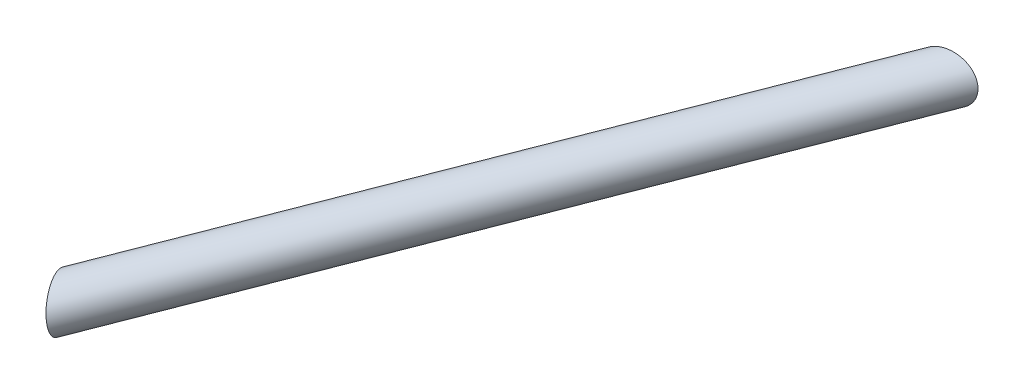
ISO-10303-21;
HEADER;
FILE_DESCRIPTION(('STEP AP214'),'2;1');
FILE_NAME('part.step','',(''),(''),'','','');
FILE_SCHEMA(('AUTOMOTIVE_DESIGN { 1 0 10303 214 1 1 1 1 }'));
ENDSEC;
DATA;
#1=APPLICATION_CONTEXT('core data for automotive mechanical design processes');
#2=APPLICATION_PROTOCOL_DEFINITION('international standard','automotive_design',2000,#1);
#3=PRODUCT_CONTEXT('',#1,'mechanical');
#4=PRODUCT('Part','Part','',(#3));
#5=PRODUCT_RELATED_PRODUCT_CATEGORY('part','',(#4));
#6=PRODUCT_DEFINITION_FORMATION('','',#4);
#7=PRODUCT_DEFINITION_CONTEXT('part definition',#1,'design');
#8=PRODUCT_DEFINITION('design','',#6,#7);
#9=PRODUCT_DEFINITION_SHAPE('','',#8);
#10=(LENGTH_UNIT() NAMED_UNIT(*) SI_UNIT(.MILLI.,.METRE.));
#11=(NAMED_UNIT(*) PLANE_ANGLE_UNIT() SI_UNIT($,.RADIAN.));
#12=(NAMED_UNIT(*) SI_UNIT($,.STERADIAN.) SOLID_ANGLE_UNIT());
#13=UNCERTAINTY_MEASURE_WITH_UNIT(LENGTH_MEASURE(1.E-05),#10,'distance_accuracy_value','');
#14=(GEOMETRIC_REPRESENTATION_CONTEXT(3) GLOBAL_UNCERTAINTY_ASSIGNED_CONTEXT((#13)) GLOBAL_UNIT_ASSIGNED_CONTEXT((#10,
#11,#12)) REPRESENTATION_CONTEXT('',''));
#15=CARTESIAN_POINT('',(0.,0.,0.));
#16=DIRECTION('',(0.,0.,1.));
#17=DIRECTION('',(1.,0.,0.));
#18=AXIS2_PLACEMENT_3D('',#15,#16,#17);
#19=CARTESIAN_POINT('',(50.0000000000001,130.,0.));
#20=DIRECTION('',(0.636784790371593,0.254713916148637,-0.727754046138963));
#21=DIRECTION('',(-0.752576694706878,0.,-0.658504607868518));
#22=AXIS2_PLACEMENT_3D('',#19,#20,#21);
#23=CYLINDRICAL_SURFACE('',#22,7.9);
#24=CARTESIAN_POINT('',(200.,190.,-171.428571428571));
#25=DIRECTION('',(0.,1.,0.));
#26=DIRECTION('',(0.658504607868518,0.,-0.752576694706878));
#27=AXIS2_PLACEMENT_3D('',#24,#25,#26);
#28=ELLIPSE('',#27,31.0151880174069,7.9);
#29=CARTESIAN_POINT('',(210.501750606368,190.,-191.792183638289));
#30=VERTEX_POINT('',#29);
#31=CARTESIAN_POINT('',(208.021674420814,190.,-190.));
#32=VERTEX_POINT('',#31);
#33=EDGE_CURVE('E105',#30,#32,#28,.T.);
#34=ORIENTED_EDGE('',*,*,#33,.T.);
#35=CARTESIAN_POINT('',(216.25,196.5,-190.));
#36=DIRECTION('',(0.,0.,-1.));
#37=DIRECTION('',(0.928476690885259,0.371390676354104,0.));
#38=AXIS2_PLACEMENT_3D('',#35,#36,#37);
#39=ELLIPSE('',#38,10.8553158060924,7.9);
#40=CARTESIAN_POINT('',(225.631031113065,201.793088485731,-190.));
#41=VERTEX_POINT('',#40);
#42=EDGE_CURVE('E94',#32,#41,#39,.T.);
#43=ORIENTED_EDGE('',*,*,#42,.T.);
#44=CARTESIAN_POINT('',(216.296701231053,196.518680492421,-190.053372835489));
#45=DIRECTION('',(0.00725504842418489,-0.00272064315906933,-0.999969980736004));
#46=DIRECTION('',(0.92636602089052,0.376581393205428,0.00569645775229216));
#47=AXIS2_PLACEMENT_3D('',#44,#45,#46);
#48=ELLIPSE('',#47,10.7973779076221,7.9);
#49=CARTESIAN_POINT('',(221.285617721625,190.205319441892,-190.));
#50=VERTEX_POINT('',#49);
#51=EDGE_CURVE('E104',#41,#50,#48,.T.);
#52=ORIENTED_EDGE('',*,*,#51,.T.);
#53=CARTESIAN_POINT('',(220.93155497785,190.,-190.));
#54=VERTEX_POINT('',#53);
#55=EDGE_CURVE('E107',#50,#54,#39,.T.);
#56=ORIENTED_EDGE('',*,*,#55,.T.);
#57=CARTESIAN_POINT('',(220.932059222931,190.,-190.002006543329));
#58=VERTEX_POINT('',#57);
#59=EDGE_CURVE('E57',#54,#58,#28,.T.);
#60=ORIENTED_EDGE('',*,*,#59,.T.);
#61=CARTESIAN_POINT('',(210.067474820191,188.879764778789,-190.077784143776));
#62=VERTEX_POINT('',#61);
#63=EDGE_CURVE('E119',#58,#62,#48,.T.);
#64=ORIENTED_EDGE('',*,*,#63,.T.);
#65=CARTESIAN_POINT('',(212.293529390494,194.917411756198,-185.478319303422));
#66=DIRECTION('',(0.936301069656276,-0.351112901121103,0.00774839511359747));
#67=DIRECTION('',(0.193627409873278,0.497681819611522,-0.845471012261172));
#68=AXIS2_PLACEMENT_3D('',#65,#66,#67);
#69=ELLIPSE('',#68,15.7637429996587,7.9);
#70=EDGE_CURVE('E116',#62,#30,#69,.T.);
#71=ORIENTED_EDGE('',*,*,#70,.T.);
#72=EDGE_LOOP('',(#34,#43,#52,#56,#60,#64,#71));
#73=FACE_BOUND('',#72,.T.);
#74=CARTESIAN_POINT('',(50.,130.,0.));
#75=DIRECTION('',(-0.904650427063292,-0.140780299510552,0.402229427173004));
#76=DIRECTION('',(-0.426154437750217,0.298851652810821,-0.853861865173774));
#77=AXIS2_PLACEMENT_3D('',#74,#75,#76);
#78=ELLIPSE('',#77,8.73265491693323,7.9);
#79=CARTESIAN_POINT('',(46.2785403538077,132.609768355352,-7.45648101529144));
#80=VERTEX_POINT('',#79);
#81=EDGE_CURVE('E43',#80,#80,#78,.T.);
#82=ORIENTED_EDGE('',*,*,#81,.T.);
#83=EDGE_LOOP('',(#82));
#84=FACE_BOUND('',#83,.T.);
#85=ADVANCED_FACE('F39',(#73,#84),#23,.F.);
#86=CARTESIAN_POINT('',(50.0000000000001,130.,0.));
#87=DIRECTION('',(0.636784790371593,0.254713916148637,-0.727754046138963));
#88=DIRECTION('',(-0.752576694706878,0.,-0.658504607868518));
#89=AXIS2_PLACEMENT_3D('',#86,#87,#88);
#90=CYLINDRICAL_SURFACE('',#89,9.5);
#91=CARTESIAN_POINT('',(212.293529390494,194.917411756198,-185.478319303422));
#92=DIRECTION('',(0.936301069656276,-0.351112901121103,0.00774839511359747));
#93=DIRECTION('',(0.193627409873278,0.497681819611522,-0.845471012261172));
#94=AXIS2_PLACEMENT_3D('',#91,#92,#93);
#95=ELLIPSE('',#94,18.9563998097161,9.5);
#96=CARTESIAN_POINT('',(209.403366029717,187.108808004192,-190.077784143776));
#97=VERTEX_POINT('',#96);
#98=CARTESIAN_POINT('',(210.523511327107,190.,-194.42170701778));
#99=VERTEX_POINT('',#98);
#100=EDGE_CURVE('E129',#97,#99,#95,.T.);
#101=ORIENTED_EDGE('',*,*,#100,.F.);
#102=CARTESIAN_POINT('',(216.296701231053,196.518680492421,-190.053372835489));
#103=DIRECTION('',(0.00725504842418489,-0.00272064315906933,-0.999969980736004));
#104=DIRECTION('',(0.92636602089052,0.376581393205428,0.00569645775229216));
#105=AXIS2_PLACEMENT_3D('',#102,#103,#104);
#106=ELLIPSE('',#105,12.9841886230899,9.5);
#107=CARTESIAN_POINT('',(226.472431202689,204.036822058062,-190.));
#108=VERTEX_POINT('',#107);
#109=EDGE_CURVE('E128',#108,#97,#106,.T.);
#110=ORIENTED_EDGE('',*,*,#109,.F.);
#111=CARTESIAN_POINT('',(216.25,196.5,-190.));
#112=DIRECTION('',(0.,0.,-1.));
#113=DIRECTION('',(0.928476690885259,0.371390676354104,0.));
#114=AXIS2_PLACEMENT_3D('',#111,#112,#113);
#115=ELLIPSE('',#114,13.0538607794782,9.5);
#116=CARTESIAN_POINT('',(205.069430309634,190.,-190.));
#117=VERTEX_POINT('',#116);
#118=EDGE_CURVE('E125',#117,#108,#115,.T.);
#119=ORIENTED_EDGE('',*,*,#118,.F.);
#120=CARTESIAN_POINT('',(200.,190.,-171.428571428571));
#121=DIRECTION('',(0.,1.,0.));
#122=DIRECTION('',(0.658504607868518,0.,-0.752576694706878));
#123=AXIS2_PLACEMENT_3D('',#120,#121,#122);
#124=ELLIPSE('',#123,37.2967450842235,9.5);
#125=EDGE_CURVE('E110',#99,#117,#124,.T.);
#126=ORIENTED_EDGE('',*,*,#125,.F.);
#127=EDGE_LOOP('',(#101,#110,#119,#126));
#128=FACE_BOUND('',#127,.T.);
#129=CARTESIAN_POINT('',(50.,130.,0.));
#130=DIRECTION('',(-0.904650427063292,-0.140780299510552,0.402229427173004));
#131=DIRECTION('',(-0.426154437750217,0.298851652810821,-0.853861865173774));
#132=AXIS2_PLACEMENT_3D('',#129,#130,#131);
#133=ELLIPSE('',#132,10.5012938874513,9.5);
#134=CARTESIAN_POINT('',(45.5248270077434,133.138329034917,-8.96665438547707));
#135=VERTEX_POINT('',#134);
#136=EDGE_CURVE('E11',#135,#135,#133,.T.);
#137=ORIENTED_EDGE('',*,*,#136,.F.);
#138=EDGE_LOOP('',(#137));
#139=FACE_BOUND('',#138,.T.);
#140=ADVANCED_FACE('F148',(#128,#139),#90,.T.);
#141=CARTESIAN_POINT('',(215.709539787679,203.48392257962,-210.077183758496));
#142=DIRECTION('',(0.936301069656276,-0.351112901121103,0.00774839511359747));
#143=DIRECTION('',(0.351123441588392,0.936329177569045,0.));
#144=AXIS2_PLACEMENT_3D('',#141,#142,#143);
#145=PLANE('',#144);
#146=DIRECTION('',(-0.351123441588392,-0.936329177569044,0.));
#147=VECTOR('',#146,1.);
#148=CARTESIAN_POINT('',(215.564438819195,203.538335442802,-190.077784143776));
#149=LINE('',#148,#147);
#150=EDGE_CURVE('E130',#62,#97,#149,.T.);
#151=ORIENTED_EDGE('',*,*,#150,.T.);
#152=ORIENTED_EDGE('',*,*,#100,.T.);
#153=DIRECTION('',(0.00827525467579686,0.,-0.999965759493819));
#154=VECTOR('',#153,1.);
#155=CARTESIAN_POINT('',(210.457097247969,190.,-186.396358229372));
#156=LINE('',#155,#154);
#157=EDGE_CURVE('E87',#30,#99,#156,.T.);
#158=ORIENTED_EDGE('',*,*,#157,.F.);
#159=ORIENTED_EDGE('',*,*,#70,.F.);
#160=EDGE_LOOP('',(#151,#152,#158,#159));
#161=FACE_BOUND('',#160,.T.);
#162=ADVANCED_FACE('F151',(#161),#145,.T.);
#163=CARTESIAN_POINT('',(234.290460212321,196.51607742038,-189.922816241504));
#164=DIRECTION('',(0.00725504842418489,-0.00272064315906933,-0.999969980736004));
#165=DIRECTION('',(-0.999973681595049,0.,-0.00725507527490251));
#166=AXIS2_PLACEMENT_3D('',#163,#164,#165);
#167=PLANE('',#166);
#168=DIRECTION('',(-0.999973681595049,0.,-0.00725507527490251));
#169=VECTOR('',#168,1.);
#170=CARTESIAN_POINT('',(-224.976513310608,190.,-193.237191947704));
#171=LINE('',#170,#169);
#172=CARTESIAN_POINT('',(221.208622930916,190.,-190.));
#173=VERTEX_POINT('',#172);
#174=EDGE_CURVE('E49',#173,#58,#171,.T.);
#175=ORIENTED_EDGE('',*,*,#174,.F.);
#176=DIRECTION('',(-0.351123441588392,-0.936329177569045,0.));
#177=VECTOR('',#176,1.);
#178=CARTESIAN_POINT('',(166.196600925734,43.3012746528497,-190.));
#179=LINE('',#178,#177);
#180=EDGE_CURVE('E127',#50,#173,#179,.T.);
#181=ORIENTED_EDGE('',*,*,#180,.F.);
#182=ORIENTED_EDGE('',*,*,#51,.F.);
#183=EDGE_CURVE('E100',#108,#41,#179,.T.);
#184=ORIENTED_EDGE('',*,*,#183,.F.);
#185=ORIENTED_EDGE('',*,*,#109,.T.);
#186=ORIENTED_EDGE('',*,*,#150,.F.);
#187=ORIENTED_EDGE('',*,*,#63,.F.);
#188=EDGE_LOOP('',(#175,#181,#182,#184,#185,#186,#187));
#189=FACE_BOUND('',#188,.T.);
#190=ADVANCED_FACE('F145',(#189),#167,.T.);
#191=CARTESIAN_POINT('',(-225.,190.,-190.));
#192=DIRECTION('',(0.,0.,-1.));
#193=DIRECTION('',(-1.,0.,0.));
#194=AXIS2_PLACEMENT_3D('',#191,#192,#193);
#195=PLANE('',#194);
#196=ORIENTED_EDGE('',*,*,#180,.T.);
#197=DIRECTION('',(1.,0.,0.));
#198=VECTOR('',#197,1.);
#199=CARTESIAN_POINT('',(-225.,190.,-190.));
#200=LINE('',#199,#198);
#201=EDGE_CURVE('E111',#54,#173,#200,.T.);
#202=ORIENTED_EDGE('',*,*,#201,.F.);
#203=ORIENTED_EDGE('',*,*,#55,.F.);
#204=EDGE_LOOP('',(#196,#202,#203));
#205=FACE_BOUND('',#204,.T.);
#206=ADVANCED_FACE('F169',(#205),#195,.T.);
#207=EDGE_CURVE('E97',#117,#32,#200,.T.);
#208=ORIENTED_EDGE('',*,*,#207,.F.);
#209=ORIENTED_EDGE('',*,*,#118,.T.);
#210=ORIENTED_EDGE('',*,*,#183,.T.);
#211=ORIENTED_EDGE('',*,*,#42,.F.);
#212=EDGE_LOOP('',(#208,#209,#210,#211));
#213=FACE_BOUND('',#212,.T.);
#214=ADVANCED_FACE('F96',(#213),#195,.T.);
#215=CARTESIAN_POINT('',(-225.,190.,-190.));
#216=DIRECTION('',(0.,1.,0.));
#217=DIRECTION('',(0.,0.,1.));
#218=AXIS2_PLACEMENT_3D('',#215,#216,#217);
#219=PLANE('',#218);
#220=ORIENTED_EDGE('',*,*,#157,.T.);
#221=ORIENTED_EDGE('',*,*,#125,.T.);
#222=ORIENTED_EDGE('',*,*,#207,.T.);
#223=ORIENTED_EDGE('',*,*,#33,.F.);
#224=EDGE_LOOP('',(#220,#221,#222,#223));
#225=FACE_BOUND('',#224,.T.);
#226=ADVANCED_FACE('F108',(#225),#219,.T.);
#227=ORIENTED_EDGE('',*,*,#201,.T.);
#228=ORIENTED_EDGE('',*,*,#174,.T.);
#229=ORIENTED_EDGE('',*,*,#59,.F.);
#230=EDGE_LOOP('',(#227,#228,#229));
#231=FACE_BOUND('',#230,.T.);
#232=ADVANCED_FACE('F142',(#231),#219,.T.);
#233=CARTESIAN_POINT('',(50.,130.,0.));
#234=DIRECTION('',(-0.904650427063292,-0.140780299510552,0.402229427173004));
#235=DIRECTION('',(0.406275581998161,0.,0.913750595880547));
#236=AXIS2_PLACEMENT_3D('',#233,#234,#235);
#237=PLANE('',#236);
#238=ORIENTED_EDGE('',*,*,#81,.F.);
#239=EDGE_LOOP('',(#238));
#240=FACE_BOUND('',#239,.T.);
#241=ORIENTED_EDGE('',*,*,#136,.T.);
#242=EDGE_LOOP('',(#241));
#243=FACE_BOUND('',#242,.T.);
#244=ADVANCED_FACE('F41',(#240,#243),#237,.T.);
#245=CLOSED_SHELL('',(#85,#140,#162,#190,#206,#214,#226,#232,#244));
#246=MANIFOLD_SOLID_BREP('B2',#245);
#247=ADVANCED_BREP_SHAPE_REPRESENTATION('',(#18,#246),#14);
#248=SHAPE_DEFINITION_REPRESENTATION(#9,#247);
ENDSEC;
END-ISO-10303-21;
